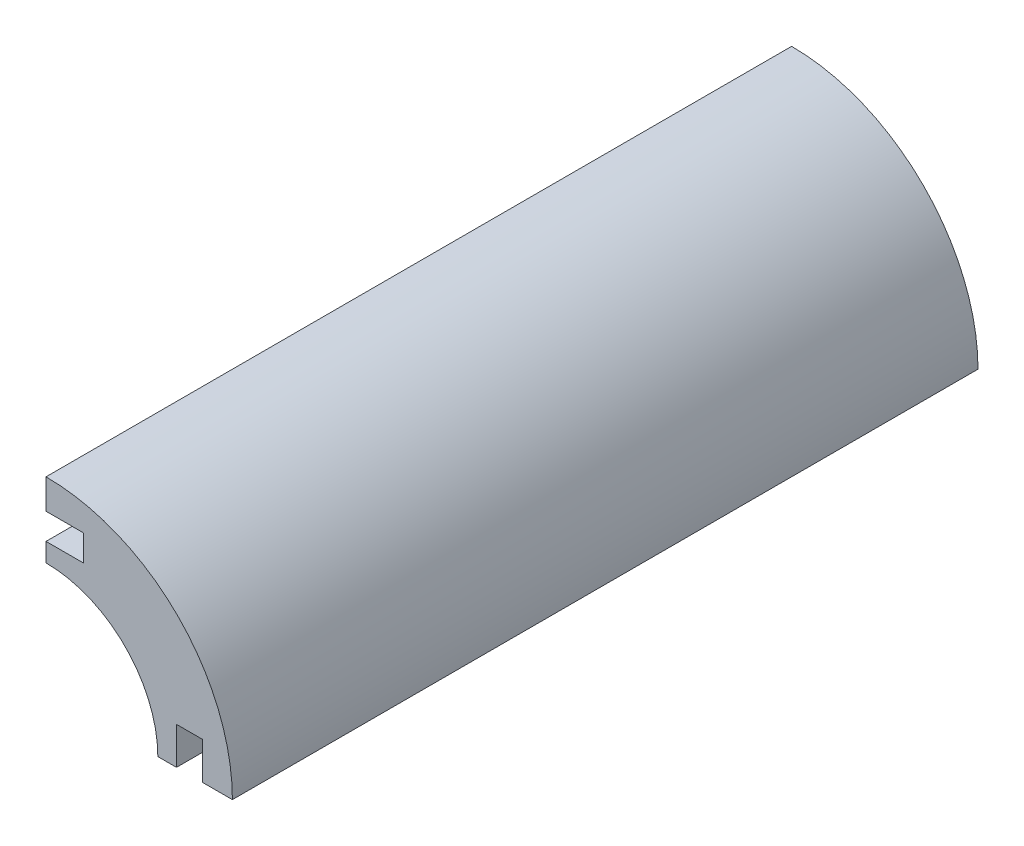
ISO-10303-21;
HEADER;
FILE_DESCRIPTION(('STEP AP214'),'2;1');
FILE_NAME('part.step','',(''),(''),'','','');
FILE_SCHEMA(('AUTOMOTIVE_DESIGN { 1 0 10303 214 1 1 1 1 }'));
ENDSEC;
DATA;
#1=APPLICATION_CONTEXT('core data for automotive mechanical design processes');
#2=APPLICATION_PROTOCOL_DEFINITION('international standard','automotive_design',2000,#1);
#3=PRODUCT_CONTEXT('',#1,'mechanical');
#4=PRODUCT('Part','Part','',(#3));
#5=PRODUCT_RELATED_PRODUCT_CATEGORY('part','',(#4));
#6=PRODUCT_DEFINITION_FORMATION('','',#4);
#7=PRODUCT_DEFINITION_CONTEXT('part definition',#1,'design');
#8=PRODUCT_DEFINITION('design','',#6,#7);
#9=PRODUCT_DEFINITION_SHAPE('','',#8);
#10=(LENGTH_UNIT() NAMED_UNIT(*) SI_UNIT(.MILLI.,.METRE.));
#11=(NAMED_UNIT(*) PLANE_ANGLE_UNIT() SI_UNIT($,.RADIAN.));
#12=(NAMED_UNIT(*) SI_UNIT($,.STERADIAN.) SOLID_ANGLE_UNIT());
#13=UNCERTAINTY_MEASURE_WITH_UNIT(LENGTH_MEASURE(1.E-05),#10,'distance_accuracy_value','');
#14=(GEOMETRIC_REPRESENTATION_CONTEXT(3) GLOBAL_UNCERTAINTY_ASSIGNED_CONTEXT((#13)) GLOBAL_UNIT_ASSIGNED_CONTEXT((#10,
#11,#12)) REPRESENTATION_CONTEXT('',''));
#15=CARTESIAN_POINT('',(0.,0.,0.));
#16=DIRECTION('',(0.,0.,1.));
#17=DIRECTION('',(1.,0.,0.));
#18=AXIS2_PLACEMENT_3D('',#15,#16,#17);
#19=CARTESIAN_POINT('',(0.,0.,-200.));
#20=DIRECTION('',(0.,0.,1.));
#21=DIRECTION('',(1.,0.,0.));
#22=AXIS2_PLACEMENT_3D('',#19,#20,#21);
#23=CYLINDRICAL_SURFACE('',#22,50.);
#24=CARTESIAN_POINT('',(0.,0.,0.));
#25=DIRECTION('',(0.,0.,1.));
#26=DIRECTION('',(1.,0.,0.));
#27=AXIS2_PLACEMENT_3D('',#24,#25,#26);
#28=CIRCLE('',#27,50.);
#29=CARTESIAN_POINT('',(50.,0.,0.));
#30=VERTEX_POINT('',#29);
#31=CARTESIAN_POINT('',(0.,50.,0.));
#32=VERTEX_POINT('',#31);
#33=EDGE_CURVE('E168',#30,#32,#28,.T.);
#34=ORIENTED_EDGE('',*,*,#33,.F.);
#35=DIRECTION('',(0.,0.,1.));
#36=VECTOR('',#35,1.);
#37=CARTESIAN_POINT('',(50.,0.,-200.));
#38=LINE('',#37,#36);
#39=CARTESIAN_POINT('',(50.,0.,-200.));
#40=VERTEX_POINT('',#39);
#41=EDGE_CURVE('E11',#40,#30,#38,.T.);
#42=ORIENTED_EDGE('',*,*,#41,.F.);
#43=CARTESIAN_POINT('',(0.,0.,-200.));
#44=DIRECTION('',(0.,0.,1.));
#45=DIRECTION('',(1.,0.,0.));
#46=AXIS2_PLACEMENT_3D('',#43,#44,#45);
#47=CIRCLE('',#46,50.);
#48=CARTESIAN_POINT('',(0.,50.,-200.));
#49=VERTEX_POINT('',#48);
#50=EDGE_CURVE('E213',#40,#49,#47,.T.);
#51=ORIENTED_EDGE('',*,*,#50,.T.);
#52=DIRECTION('',(0.,0.,1.));
#53=VECTOR('',#52,1.);
#54=CARTESIAN_POINT('',(0.,50.,-200.));
#55=LINE('',#54,#53);
#56=EDGE_CURVE('E42',#49,#32,#55,.T.);
#57=ORIENTED_EDGE('',*,*,#56,.T.);
#58=EDGE_LOOP('',(#34,#42,#51,#57));
#59=FACE_BOUND('',#58,.T.);
#60=ADVANCED_FACE('F39',(#59),#23,.T.);
#61=CARTESIAN_POINT('',(42.,0.,-200.));
#62=DIRECTION('',(0.,-1.,0.));
#63=DIRECTION('',(0.,0.,-1.));
#64=AXIS2_PLACEMENT_3D('',#61,#62,#63);
#65=PLANE('',#64);
#66=DIRECTION('',(1.,0.,0.));
#67=VECTOR('',#66,1.);
#68=CARTESIAN_POINT('',(42.,0.,0.));
#69=LINE('',#68,#67);
#70=CARTESIAN_POINT('',(42.,0.,0.));
#71=VERTEX_POINT('',#70);
#72=EDGE_CURVE('E210',#71,#30,#69,.T.);
#73=ORIENTED_EDGE('',*,*,#72,.F.);
#74=DIRECTION('',(0.,0.,1.));
#75=VECTOR('',#74,1.);
#76=CARTESIAN_POINT('',(42.,0.,-200.));
#77=LINE('',#76,#75);
#78=CARTESIAN_POINT('',(42.,0.,-200.));
#79=VERTEX_POINT('',#78);
#80=EDGE_CURVE('E49',#79,#71,#77,.T.);
#81=ORIENTED_EDGE('',*,*,#80,.F.);
#82=DIRECTION('',(1.,0.,0.));
#83=VECTOR('',#82,1.);
#84=CARTESIAN_POINT('',(42.,0.,-200.));
#85=LINE('',#84,#83);
#86=EDGE_CURVE('E154',#79,#40,#85,.T.);
#87=ORIENTED_EDGE('',*,*,#86,.T.);
#88=ORIENTED_EDGE('',*,*,#41,.T.);
#89=EDGE_LOOP('',(#73,#81,#87,#88));
#90=FACE_BOUND('',#89,.T.);
#91=ADVANCED_FACE('F243',(#90),#65,.T.);
#92=CARTESIAN_POINT('',(42.,10.,-200.));
#93=DIRECTION('',(-1.,0.,0.));
#94=DIRECTION('',(0.,0.,1.));
#95=AXIS2_PLACEMENT_3D('',#92,#93,#94);
#96=PLANE('',#95);
#97=DIRECTION('',(0.,-1.,0.));
#98=VECTOR('',#97,1.);
#99=CARTESIAN_POINT('',(42.,10.,0.));
#100=LINE('',#99,#98);
#101=CARTESIAN_POINT('',(42.,10.,0.));
#102=VERTEX_POINT('',#101);
#103=EDGE_CURVE('E140',#102,#71,#100,.T.);
#104=ORIENTED_EDGE('',*,*,#103,.F.);
#105=DIRECTION('',(0.,0.,1.));
#106=VECTOR('',#105,1.);
#107=CARTESIAN_POINT('',(42.,10.,-200.));
#108=LINE('',#107,#106);
#109=CARTESIAN_POINT('',(42.,10.,-200.));
#110=VERTEX_POINT('',#109);
#111=EDGE_CURVE('E135',#110,#102,#108,.T.);
#112=ORIENTED_EDGE('',*,*,#111,.F.);
#113=DIRECTION('',(0.,-1.,0.));
#114=VECTOR('',#113,1.);
#115=CARTESIAN_POINT('',(42.,10.,-200.));
#116=LINE('',#115,#114);
#117=EDGE_CURVE('E138',#110,#79,#116,.T.);
#118=ORIENTED_EDGE('',*,*,#117,.T.);
#119=ORIENTED_EDGE('',*,*,#80,.T.);
#120=EDGE_LOOP('',(#104,#112,#118,#119));
#121=FACE_BOUND('',#120,.T.);
#122=ADVANCED_FACE('F137',(#121),#96,.T.);
#123=CARTESIAN_POINT('',(35.,10.,-200.));
#124=DIRECTION('',(0.,-1.,0.));
#125=DIRECTION('',(0.,0.,-1.));
#126=AXIS2_PLACEMENT_3D('',#123,#124,#125);
#127=PLANE('',#126);
#128=DIRECTION('',(1.,0.,0.));
#129=VECTOR('',#128,1.);
#130=CARTESIAN_POINT('',(35.,10.,0.));
#131=LINE('',#130,#129);
#132=CARTESIAN_POINT('',(35.,10.,0.));
#133=VERTEX_POINT('',#132);
#134=EDGE_CURVE('E205',#133,#102,#131,.T.);
#135=ORIENTED_EDGE('',*,*,#134,.F.);
#136=DIRECTION('',(0.,0.,1.));
#137=VECTOR('',#136,1.);
#138=CARTESIAN_POINT('',(35.,10.,-200.));
#139=LINE('',#138,#137);
#140=CARTESIAN_POINT('',(35.,10.,-200.));
#141=VERTEX_POINT('',#140);
#142=EDGE_CURVE('E146',#141,#133,#139,.T.);
#143=ORIENTED_EDGE('',*,*,#142,.F.);
#144=DIRECTION('',(1.,0.,0.));
#145=VECTOR('',#144,1.);
#146=CARTESIAN_POINT('',(35.,10.,-200.));
#147=LINE('',#146,#145);
#148=EDGE_CURVE('E152',#141,#110,#147,.T.);
#149=ORIENTED_EDGE('',*,*,#148,.T.);
#150=ORIENTED_EDGE('',*,*,#111,.T.);
#151=EDGE_LOOP('',(#135,#143,#149,#150));
#152=FACE_BOUND('',#151,.T.);
#153=ADVANCED_FACE('F157',(#152),#127,.T.);
#154=CARTESIAN_POINT('',(35.,0.,-200.));
#155=DIRECTION('',(1.,0.,0.));
#156=DIRECTION('',(0.,0.,-1.));
#157=AXIS2_PLACEMENT_3D('',#154,#155,#156);
#158=PLANE('',#157);
#159=DIRECTION('',(0.,1.,0.));
#160=VECTOR('',#159,1.);
#161=CARTESIAN_POINT('',(35.,0.,0.));
#162=LINE('',#161,#160);
#163=CARTESIAN_POINT('',(35.,0.,0.));
#164=VERTEX_POINT('',#163);
#165=EDGE_CURVE('E201',#164,#133,#162,.T.);
#166=ORIENTED_EDGE('',*,*,#165,.F.);
#167=DIRECTION('',(0.,0.,1.));
#168=VECTOR('',#167,1.);
#169=CARTESIAN_POINT('',(35.,0.,-200.));
#170=LINE('',#169,#168);
#171=CARTESIAN_POINT('',(35.,0.,-200.));
#172=VERTEX_POINT('',#171);
#173=EDGE_CURVE('E219',#172,#164,#170,.T.);
#174=ORIENTED_EDGE('',*,*,#173,.F.);
#175=DIRECTION('',(0.,1.,0.));
#176=VECTOR('',#175,1.);
#177=CARTESIAN_POINT('',(35.,0.,-200.));
#178=LINE('',#177,#176);
#179=EDGE_CURVE('E159',#172,#141,#178,.T.);
#180=ORIENTED_EDGE('',*,*,#179,.T.);
#181=ORIENTED_EDGE('',*,*,#142,.T.);
#182=EDGE_LOOP('',(#166,#174,#180,#181));
#183=FACE_BOUND('',#182,.T.);
#184=ADVANCED_FACE('F256',(#183),#158,.T.);
#185=CARTESIAN_POINT('',(30.,0.,-200.));
#186=DIRECTION('',(0.,-1.,0.));
#187=DIRECTION('',(0.,0.,-1.));
#188=AXIS2_PLACEMENT_3D('',#185,#186,#187);
#189=PLANE('',#188);
#190=DIRECTION('',(1.,0.,0.));
#191=VECTOR('',#190,1.);
#192=CARTESIAN_POINT('',(30.,0.,0.));
#193=LINE('',#192,#191);
#194=CARTESIAN_POINT('',(30.,0.,0.));
#195=VERTEX_POINT('',#194);
#196=EDGE_CURVE('E197',#195,#164,#193,.T.);
#197=ORIENTED_EDGE('',*,*,#196,.F.);
#198=DIRECTION('',(0.,0.,1.));
#199=VECTOR('',#198,1.);
#200=CARTESIAN_POINT('',(30.,0.,-200.));
#201=LINE('',#200,#199);
#202=CARTESIAN_POINT('',(30.,0.,-200.));
#203=VERTEX_POINT('',#202);
#204=EDGE_CURVE('E222',#203,#195,#201,.T.);
#205=ORIENTED_EDGE('',*,*,#204,.F.);
#206=DIRECTION('',(1.,0.,0.));
#207=VECTOR('',#206,1.);
#208=CARTESIAN_POINT('',(30.,0.,-200.));
#209=LINE('',#208,#207);
#210=EDGE_CURVE('E162',#203,#172,#209,.T.);
#211=ORIENTED_EDGE('',*,*,#210,.T.);
#212=ORIENTED_EDGE('',*,*,#173,.T.);
#213=EDGE_LOOP('',(#197,#205,#211,#212));
#214=FACE_BOUND('',#213,.T.);
#215=ADVANCED_FACE('F259',(#214),#189,.T.);
#216=CARTESIAN_POINT('',(0.,0.,-200.));
#217=DIRECTION('',(0.,0.,1.));
#218=DIRECTION('',(1.,0.,0.));
#219=AXIS2_PLACEMENT_3D('',#216,#217,#218);
#220=CYLINDRICAL_SURFACE('',#219,30.);
#221=CARTESIAN_POINT('',(0.,0.,0.));
#222=DIRECTION('',(0.,0.,-1.));
#223=DIRECTION('',(-1.,0.,0.));
#224=AXIS2_PLACEMENT_3D('',#221,#222,#223);
#225=CIRCLE('',#224,30.);
#226=CARTESIAN_POINT('',(0.,30.,0.));
#227=VERTEX_POINT('',#226);
#228=EDGE_CURVE('E193',#227,#195,#225,.T.);
#229=ORIENTED_EDGE('',*,*,#228,.F.);
#230=DIRECTION('',(0.,0.,1.));
#231=VECTOR('',#230,1.);
#232=CARTESIAN_POINT('',(0.,30.,-200.));
#233=LINE('',#232,#231);
#234=CARTESIAN_POINT('',(0.,30.,-200.));
#235=VERTEX_POINT('',#234);
#236=EDGE_CURVE('E225',#235,#227,#233,.T.);
#237=ORIENTED_EDGE('',*,*,#236,.F.);
#238=CARTESIAN_POINT('',(0.,0.,-200.));
#239=DIRECTION('',(0.,0.,-1.));
#240=DIRECTION('',(-1.,0.,0.));
#241=AXIS2_PLACEMENT_3D('',#238,#239,#240);
#242=CIRCLE('',#241,30.);
#243=EDGE_CURVE('E333',#235,#203,#242,.T.);
#244=ORIENTED_EDGE('',*,*,#243,.T.);
#245=ORIENTED_EDGE('',*,*,#204,.T.);
#246=EDGE_LOOP('',(#229,#237,#244,#245));
#247=FACE_BOUND('',#246,.T.);
#248=ADVANCED_FACE('F263',(#247),#220,.F.);
#249=CARTESIAN_POINT('',(0.,35.,-200.));
#250=DIRECTION('',(-1.,0.,0.));
#251=DIRECTION('',(0.,-1.,0.));
#252=AXIS2_PLACEMENT_3D('',#249,#250,#251);
#253=PLANE('',#252);
#254=DIRECTION('',(0.,-1.,0.));
#255=VECTOR('',#254,1.);
#256=CARTESIAN_POINT('',(0.,35.,0.));
#257=LINE('',#256,#255);
#258=CARTESIAN_POINT('',(0.,35.,0.));
#259=VERTEX_POINT('',#258);
#260=EDGE_CURVE('E189',#259,#227,#257,.T.);
#261=ORIENTED_EDGE('',*,*,#260,.F.);
#262=DIRECTION('',(0.,0.,1.));
#263=VECTOR('',#262,1.);
#264=CARTESIAN_POINT('',(0.,35.,-200.));
#265=LINE('',#264,#263);
#266=CARTESIAN_POINT('',(0.,35.,-200.));
#267=VERTEX_POINT('',#266);
#268=EDGE_CURVE('E228',#267,#259,#265,.T.);
#269=ORIENTED_EDGE('',*,*,#268,.F.);
#270=DIRECTION('',(0.,-1.,0.));
#271=VECTOR('',#270,1.);
#272=CARTESIAN_POINT('',(0.,35.,-200.));
#273=LINE('',#272,#271);
#274=EDGE_CURVE('E329',#267,#235,#273,.T.);
#275=ORIENTED_EDGE('',*,*,#274,.T.);
#276=ORIENTED_EDGE('',*,*,#236,.T.);
#277=EDGE_LOOP('',(#261,#269,#275,#276));
#278=FACE_BOUND('',#277,.T.);
#279=ADVANCED_FACE('F267',(#278),#253,.T.);
#280=CARTESIAN_POINT('',(10.,35.,-200.));
#281=DIRECTION('',(0.,1.,0.));
#282=DIRECTION('',(0.,0.,1.));
#283=AXIS2_PLACEMENT_3D('',#280,#281,#282);
#284=PLANE('',#283);
#285=DIRECTION('',(-1.,0.,0.));
#286=VECTOR('',#285,1.);
#287=CARTESIAN_POINT('',(10.,35.,0.));
#288=LINE('',#287,#286);
#289=CARTESIAN_POINT('',(10.,35.,0.));
#290=VERTEX_POINT('',#289);
#291=EDGE_CURVE('E185',#290,#259,#288,.T.);
#292=ORIENTED_EDGE('',*,*,#291,.F.);
#293=DIRECTION('',(0.,0.,1.));
#294=VECTOR('',#293,1.);
#295=CARTESIAN_POINT('',(10.,35.,-200.));
#296=LINE('',#295,#294);
#297=CARTESIAN_POINT('',(10.,35.,-200.));
#298=VERTEX_POINT('',#297);
#299=EDGE_CURVE('E231',#298,#290,#296,.T.);
#300=ORIENTED_EDGE('',*,*,#299,.F.);
#301=DIRECTION('',(-1.,0.,0.));
#302=VECTOR('',#301,1.);
#303=CARTESIAN_POINT('',(10.,35.,-200.));
#304=LINE('',#303,#302);
#305=EDGE_CURVE('E325',#298,#267,#304,.T.);
#306=ORIENTED_EDGE('',*,*,#305,.T.);
#307=ORIENTED_EDGE('',*,*,#268,.T.);
#308=EDGE_LOOP('',(#292,#300,#306,#307));
#309=FACE_BOUND('',#308,.T.);
#310=ADVANCED_FACE('F271',(#309),#284,.T.);
#311=CARTESIAN_POINT('',(10.,42.,-200.));
#312=DIRECTION('',(-1.,0.,0.));
#313=DIRECTION('',(0.,-1.,0.));
#314=AXIS2_PLACEMENT_3D('',#311,#312,#313);
#315=PLANE('',#314);
#316=DIRECTION('',(0.,-1.,0.));
#317=VECTOR('',#316,1.);
#318=CARTESIAN_POINT('',(10.,42.,0.));
#319=LINE('',#318,#317);
#320=CARTESIAN_POINT('',(10.,42.,0.));
#321=VERTEX_POINT('',#320);
#322=EDGE_CURVE('E181',#321,#290,#319,.T.);
#323=ORIENTED_EDGE('',*,*,#322,.F.);
#324=DIRECTION('',(0.,0.,1.));
#325=VECTOR('',#324,1.);
#326=CARTESIAN_POINT('',(10.,42.,-200.));
#327=LINE('',#326,#325);
#328=CARTESIAN_POINT('',(10.,42.,-200.));
#329=VERTEX_POINT('',#328);
#330=EDGE_CURVE('E234',#329,#321,#327,.T.);
#331=ORIENTED_EDGE('',*,*,#330,.F.);
#332=DIRECTION('',(0.,-1.,0.));
#333=VECTOR('',#332,1.);
#334=CARTESIAN_POINT('',(10.,42.,-200.));
#335=LINE('',#334,#333);
#336=EDGE_CURVE('E321',#329,#298,#335,.T.);
#337=ORIENTED_EDGE('',*,*,#336,.T.);
#338=ORIENTED_EDGE('',*,*,#299,.T.);
#339=EDGE_LOOP('',(#323,#331,#337,#338));
#340=FACE_BOUND('',#339,.T.);
#341=ADVANCED_FACE('F275',(#340),#315,.T.);
#342=CARTESIAN_POINT('',(0.,42.,-200.));
#343=DIRECTION('',(0.,-1.,0.));
#344=DIRECTION('',(0.,0.,-1.));
#345=AXIS2_PLACEMENT_3D('',#342,#343,#344);
#346=PLANE('',#345);
#347=DIRECTION('',(1.,0.,0.));
#348=VECTOR('',#347,1.);
#349=CARTESIAN_POINT('',(0.,42.,0.));
#350=LINE('',#349,#348);
#351=CARTESIAN_POINT('',(0.,42.,0.));
#352=VERTEX_POINT('',#351);
#353=EDGE_CURVE('E177',#352,#321,#350,.T.);
#354=ORIENTED_EDGE('',*,*,#353,.F.);
#355=DIRECTION('',(0.,0.,1.));
#356=VECTOR('',#355,1.);
#357=CARTESIAN_POINT('',(0.,42.,-200.));
#358=LINE('',#357,#356);
#359=CARTESIAN_POINT('',(0.,42.,-200.));
#360=VERTEX_POINT('',#359);
#361=EDGE_CURVE('E236',#360,#352,#358,.T.);
#362=ORIENTED_EDGE('',*,*,#361,.F.);
#363=DIRECTION('',(1.,0.,0.));
#364=VECTOR('',#363,1.);
#365=CARTESIAN_POINT('',(0.,42.,-200.));
#366=LINE('',#365,#364);
#367=EDGE_CURVE('E317',#360,#329,#366,.T.);
#368=ORIENTED_EDGE('',*,*,#367,.T.);
#369=ORIENTED_EDGE('',*,*,#330,.T.);
#370=EDGE_LOOP('',(#354,#362,#368,#369));
#371=FACE_BOUND('',#370,.T.);
#372=ADVANCED_FACE('F279',(#371),#346,.T.);
#373=CARTESIAN_POINT('',(0.,50.,-200.));
#374=DIRECTION('',(-1.,0.,0.));
#375=DIRECTION('',(0.,-1.,0.));
#376=AXIS2_PLACEMENT_3D('',#373,#374,#375);
#377=PLANE('',#376);
#378=DIRECTION('',(0.,-1.,0.));
#379=VECTOR('',#378,1.);
#380=CARTESIAN_POINT('',(0.,50.,0.));
#381=LINE('',#380,#379);
#382=EDGE_CURVE('E172',#32,#352,#381,.T.);
#383=ORIENTED_EDGE('',*,*,#382,.F.);
#384=ORIENTED_EDGE('',*,*,#56,.F.);
#385=DIRECTION('',(0.,-1.,0.));
#386=VECTOR('',#385,1.);
#387=CARTESIAN_POINT('',(0.,50.,-200.));
#388=LINE('',#387,#386);
#389=EDGE_CURVE('E314',#49,#360,#388,.T.);
#390=ORIENTED_EDGE('',*,*,#389,.T.);
#391=ORIENTED_EDGE('',*,*,#361,.T.);
#392=EDGE_LOOP('',(#383,#384,#390,#391));
#393=FACE_BOUND('',#392,.T.);
#394=ADVANCED_FACE('F240',(#393),#377,.T.);
#395=CARTESIAN_POINT('',(0.,0.,-200.));
#396=DIRECTION('',(0.,0.,1.));
#397=DIRECTION('',(1.,0.,0.));
#398=AXIS2_PLACEMENT_3D('',#395,#396,#397);
#399=PLANE('',#398);
#400=CARTESIAN_POINT('',(28.2842712474619,28.2842712474619,-200.));
#401=DIRECTION('',(0.,0.,-1.));
#402=DIRECTION('',(-1.,0.,0.));
#403=AXIS2_PLACEMENT_3D('',#400,#401,#402);
#404=CIRCLE('',#403,2.09999999999999);
#405=CARTESIAN_POINT('',(26.1842712474619,28.2842712474619,-200.));
#406=VERTEX_POINT('',#405);
#407=EDGE_CURVE('E306',#406,#406,#404,.T.);
#408=ORIENTED_EDGE('',*,*,#407,.F.);
#409=EDGE_LOOP('',(#408));
#410=FACE_BOUND('',#409,.T.);
#411=ORIENTED_EDGE('',*,*,#50,.F.);
#412=ORIENTED_EDGE('',*,*,#86,.F.);
#413=ORIENTED_EDGE('',*,*,#117,.F.);
#414=ORIENTED_EDGE('',*,*,#148,.F.);
#415=ORIENTED_EDGE('',*,*,#179,.F.);
#416=ORIENTED_EDGE('',*,*,#210,.F.);
#417=ORIENTED_EDGE('',*,*,#243,.F.);
#418=ORIENTED_EDGE('',*,*,#274,.F.);
#419=ORIENTED_EDGE('',*,*,#305,.F.);
#420=ORIENTED_EDGE('',*,*,#336,.F.);
#421=ORIENTED_EDGE('',*,*,#367,.F.);
#422=ORIENTED_EDGE('',*,*,#389,.F.);
#423=EDGE_LOOP('',(#411,#412,#413,#414,#415,#416,#417,#418,#419,#420,#421,#422));
#424=FACE_BOUND('',#423,.T.);
#425=ADVANCED_FACE('F150',(#410,#424),#399,.F.);
#426=CARTESIAN_POINT('',(0.,0.,0.));
#427=DIRECTION('',(0.,0.,1.));
#428=DIRECTION('',(1.,0.,0.));
#429=AXIS2_PLACEMENT_3D('',#426,#427,#428);
#430=PLANE('',#429);
#431=ORIENTED_EDGE('',*,*,#33,.T.);
#432=ORIENTED_EDGE('',*,*,#382,.T.);
#433=ORIENTED_EDGE('',*,*,#353,.T.);
#434=ORIENTED_EDGE('',*,*,#322,.T.);
#435=ORIENTED_EDGE('',*,*,#291,.T.);
#436=ORIENTED_EDGE('',*,*,#260,.T.);
#437=ORIENTED_EDGE('',*,*,#228,.T.);
#438=ORIENTED_EDGE('',*,*,#196,.T.);
#439=ORIENTED_EDGE('',*,*,#165,.T.);
#440=ORIENTED_EDGE('',*,*,#134,.T.);
#441=ORIENTED_EDGE('',*,*,#103,.T.);
#442=ORIENTED_EDGE('',*,*,#72,.T.);
#443=EDGE_LOOP('',(#431,#432,#433,#434,#435,#436,#437,#438,#439,#440,#441,#442));
#444=FACE_BOUND('',#443,.T.);
#445=ADVANCED_FACE('F242',(#444),#430,.T.);
#446=CARTESIAN_POINT('',(28.2842712474619,28.2842712474619,-150.));
#447=DIRECTION('',(0.,0.,-1.));
#448=DIRECTION('',(-1.,0.,0.));
#449=AXIS2_PLACEMENT_3D('',#446,#447,#448);
#450=CONICAL_SURFACE('',#449,2.09999999999999,1.02974425867664);
#451=CARTESIAN_POINT('',(28.2842712474619,28.2842712474619,-148.738192700042));
#452=VERTEX_POINT('',#451);
#453=VERTEX_LOOP('',#452);
#454=FACE_BOUND('',#453,.T.);
#455=CARTESIAN_POINT('',(28.2842712474619,28.2842712474619,-150.));
#456=DIRECTION('',(0.,0.,-1.));
#457=DIRECTION('',(-1.,0.,0.));
#458=AXIS2_PLACEMENT_3D('',#455,#456,#457);
#459=CIRCLE('',#458,2.09999999999999);
#460=CARTESIAN_POINT('',(26.1842712474619,28.2842712474619,-150.));
#461=VERTEX_POINT('',#460);
#462=EDGE_CURVE('E173',#461,#461,#459,.T.);
#463=ORIENTED_EDGE('',*,*,#462,.T.);
#464=EDGE_LOOP('',(#463));
#465=FACE_BOUND('',#464,.T.);
#466=ADVANCED_FACE('F291',(#454,#465),#450,.F.);
#467=CARTESIAN_POINT('',(28.2842712474619,28.2842712474619,-200.));
#468=DIRECTION('',(0.,0.,-1.));
#469=DIRECTION('',(-1.,0.,0.));
#470=AXIS2_PLACEMENT_3D('',#467,#468,#469);
#471=CYLINDRICAL_SURFACE('',#470,2.09999999999999);
#472=ORIENTED_EDGE('',*,*,#462,.F.);
#473=EDGE_LOOP('',(#472));
#474=FACE_BOUND('',#473,.T.);
#475=ORIENTED_EDGE('',*,*,#407,.T.);
#476=EDGE_LOOP('',(#475));
#477=FACE_BOUND('',#476,.T.);
#478=ADVANCED_FACE('F296',(#474,#477),#471,.F.);
#479=CLOSED_SHELL('',(#60,#91,#122,#153,#184,#215,#248,#279,#310,#341,#372,#394,#425,#445,#466,#478));
#480=MANIFOLD_SOLID_BREP('B2',#479);
#481=ADVANCED_BREP_SHAPE_REPRESENTATION('',(#18,#480),#14);
#482=SHAPE_DEFINITION_REPRESENTATION(#9,#481);
ENDSEC;
END-ISO-10303-21;
